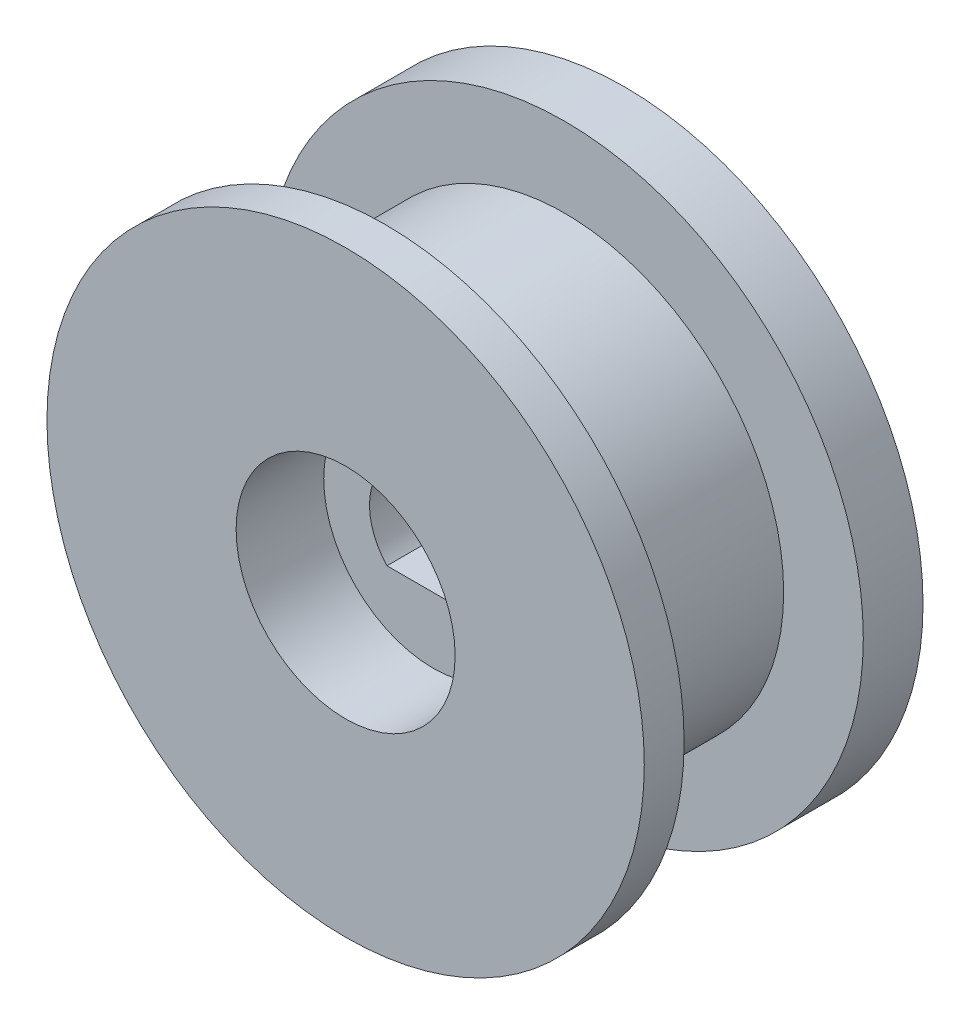
ISO-10303-21;
HEADER;
FILE_DESCRIPTION(('STEP AP214'),'2;1');
FILE_NAME('part.step','',(''),(''),'','','');
FILE_SCHEMA(('AUTOMOTIVE_DESIGN { 1 0 10303 214 1 1 1 1 }'));
ENDSEC;
DATA;
#1=APPLICATION_CONTEXT('core data for automotive mechanical design processes');
#2=APPLICATION_PROTOCOL_DEFINITION('international standard','automotive_design',2000,#1);
#3=PRODUCT_CONTEXT('',#1,'mechanical');
#4=PRODUCT('Part','Part','',(#3));
#5=PRODUCT_RELATED_PRODUCT_CATEGORY('part','',(#4));
#6=PRODUCT_DEFINITION_FORMATION('','',#4);
#7=PRODUCT_DEFINITION_CONTEXT('part definition',#1,'design');
#8=PRODUCT_DEFINITION('design','',#6,#7);
#9=PRODUCT_DEFINITION_SHAPE('','',#8);
#10=(LENGTH_UNIT() NAMED_UNIT(*) SI_UNIT(.MILLI.,.METRE.));
#11=(NAMED_UNIT(*) PLANE_ANGLE_UNIT() SI_UNIT($,.RADIAN.));
#12=(NAMED_UNIT(*) SI_UNIT($,.STERADIAN.) SOLID_ANGLE_UNIT());
#13=UNCERTAINTY_MEASURE_WITH_UNIT(LENGTH_MEASURE(1.E-05),#10,'distance_accuracy_value','');
#14=(GEOMETRIC_REPRESENTATION_CONTEXT(3) GLOBAL_UNCERTAINTY_ASSIGNED_CONTEXT((#13)) GLOBAL_UNIT_ASSIGNED_CONTEXT((#10,
#11,#12)) REPRESENTATION_CONTEXT('',''));
#15=CARTESIAN_POINT('',(0.,0.,0.));
#16=DIRECTION('',(0.,0.,1.));
#17=DIRECTION('',(1.,0.,0.));
#18=AXIS2_PLACEMENT_3D('',#15,#16,#17);
#19=CARTESIAN_POINT('',(0.,0.,3.));
#20=DIRECTION('',(0.,0.,-1.));
#21=DIRECTION('',(-1.,0.,0.));
#22=AXIS2_PLACEMENT_3D('',#19,#20,#21);
#23=CYLINDRICAL_SURFACE('',#22,1.6);
#24=CARTESIAN_POINT('',(0.,0.,-4.8));
#25=DIRECTION('',(0.,0.,-1.));
#26=DIRECTION('',(-1.,0.,0.));
#27=AXIS2_PLACEMENT_3D('',#24,#25,#26);
#28=CIRCLE('',#27,1.6);
#29=CARTESIAN_POINT('',(1.16189500386223,-1.1,-4.8));
#30=VERTEX_POINT('',#29);
#31=CARTESIAN_POINT('',(-1.16189500386223,-1.1,-4.8));
#32=VERTEX_POINT('',#31);
#33=EDGE_CURVE('E54',#30,#32,#28,.F.);
#34=ORIENTED_EDGE('',*,*,#33,.F.);
#35=DIRECTION('',(0.,0.,-1.));
#36=VECTOR('',#35,1.);
#37=CARTESIAN_POINT('',(1.16189500386223,-1.1,0.));
#38=LINE('',#37,#36);
#39=CARTESIAN_POINT('',(1.16189500386223,-1.1,-2.2));
#40=VERTEX_POINT('',#39);
#41=EDGE_CURVE('E72',#40,#30,#38,.T.);
#42=ORIENTED_EDGE('',*,*,#41,.F.);
#43=CARTESIAN_POINT('',(0.,0.,-2.2));
#44=DIRECTION('',(0.,0.,1.));
#45=DIRECTION('',(1.,0.,0.));
#46=AXIS2_PLACEMENT_3D('',#43,#44,#45);
#47=CIRCLE('',#46,1.6);
#48=CARTESIAN_POINT('',(-1.16189500386222,-1.1,-2.2));
#49=VERTEX_POINT('',#48);
#50=EDGE_CURVE('E60',#49,#40,#47,.F.);
#51=ORIENTED_EDGE('',*,*,#50,.F.);
#52=DIRECTION('',(0.,0.,-1.));
#53=VECTOR('',#52,1.);
#54=CARTESIAN_POINT('',(-1.16189500386223,-1.1,0.));
#55=LINE('',#54,#53);
#56=EDGE_CURVE('E73',#49,#32,#55,.T.);
#57=ORIENTED_EDGE('',*,*,#56,.T.);
#58=EDGE_LOOP('',(#34,#42,#51,#57));
#59=FACE_BOUND('',#58,.T.);
#60=ADVANCED_FACE('F39',(#59),#23,.F.);
#61=CARTESIAN_POINT('',(1.16189500386223,-1.1,0.));
#62=DIRECTION('',(0.,1.,0.));
#63=DIRECTION('',(0.,0.,1.));
#64=AXIS2_PLACEMENT_3D('',#61,#62,#63);
#65=PLANE('',#64);
#66=ORIENTED_EDGE('',*,*,#41,.T.);
#67=DIRECTION('',(-1.,0.,0.));
#68=VECTOR('',#67,1.);
#69=CARTESIAN_POINT('',(1.16189500386223,-1.1,-4.8));
#70=LINE('',#69,#68);
#71=EDGE_CURVE('E11',#30,#32,#70,.T.);
#72=ORIENTED_EDGE('',*,*,#71,.T.);
#73=ORIENTED_EDGE('',*,*,#56,.F.);
#74=DIRECTION('',(1.,0.,0.));
#75=VECTOR('',#74,1.);
#76=CARTESIAN_POINT('',(1.16189500386223,-1.1,-2.2));
#77=LINE('',#76,#75);
#78=EDGE_CURVE('E48',#49,#40,#77,.T.);
#79=ORIENTED_EDGE('',*,*,#78,.T.);
#80=EDGE_LOOP('',(#66,#72,#73,#79));
#81=FACE_BOUND('',#80,.T.);
#82=ADVANCED_FACE('F78',(#81),#65,.T.);
#83=CARTESIAN_POINT('',(0.,0.,0.));
#84=DIRECTION('',(0.,0.,1.));
#85=DIRECTION('',(1.,0.,0.));
#86=AXIS2_PLACEMENT_3D('',#83,#84,#85);
#87=CYLINDRICAL_SURFACE('',#86,7.5);
#88=CARTESIAN_POINT('',(0.,0.,-0.999999999999999));
#89=DIRECTION('',(0.,0.,1.));
#90=DIRECTION('',(1.,0.,0.));
#91=AXIS2_PLACEMENT_3D('',#88,#89,#90);
#92=CIRCLE('',#91,7.5);
#93=CARTESIAN_POINT('',(7.5,0.,-0.999999999999999));
#94=VERTEX_POINT('',#93);
#95=EDGE_CURVE('E106',#94,#94,#92,.T.);
#96=ORIENTED_EDGE('',*,*,#95,.T.);
#97=EDGE_LOOP('',(#96));
#98=FACE_BOUND('',#97,.T.);
#99=CARTESIAN_POINT('',(0.,0.,0.));
#100=DIRECTION('',(0.,0.,1.));
#101=DIRECTION('',(1.,0.,0.));
#102=AXIS2_PLACEMENT_3D('',#99,#100,#101);
#103=CIRCLE('',#102,7.5);
#104=CARTESIAN_POINT('',(7.5,0.,0.));
#105=VERTEX_POINT('',#104);
#106=EDGE_CURVE('E80',#105,#105,#103,.T.);
#107=ORIENTED_EDGE('',*,*,#106,.F.);
#108=EDGE_LOOP('',(#107));
#109=FACE_BOUND('',#108,.T.);
#110=ADVANCED_FACE('F41',(#98,#109),#87,.T.);
#111=CARTESIAN_POINT('',(7.5,0.,-0.999999999999999));
#112=DIRECTION('',(0.,0.,-1.));
#113=DIRECTION('',(-1.,0.,0.));
#114=AXIS2_PLACEMENT_3D('',#111,#112,#113);
#115=PLANE('',#114);
#116=CARTESIAN_POINT('',(0.,0.,-0.999999999999999));
#117=DIRECTION('',(0.,0.,1.));
#118=DIRECTION('',(1.,0.,0.));
#119=AXIS2_PLACEMENT_3D('',#116,#117,#118);
#120=CIRCLE('',#119,5.5);
#121=CARTESIAN_POINT('',(5.5,0.,-0.999999999999999));
#122=VERTEX_POINT('',#121);
#123=EDGE_CURVE('E102',#122,#122,#120,.T.);
#124=ORIENTED_EDGE('',*,*,#123,.T.);
#125=EDGE_LOOP('',(#124));
#126=FACE_BOUND('',#125,.T.);
#127=ORIENTED_EDGE('',*,*,#95,.F.);
#128=EDGE_LOOP('',(#127));
#129=FACE_BOUND('',#128,.T.);
#130=ADVANCED_FACE('F114',(#126,#129),#115,.T.);
#131=CARTESIAN_POINT('',(0.,0.,0.));
#132=DIRECTION('',(0.,0.,1.));
#133=DIRECTION('',(1.,0.,0.));
#134=AXIS2_PLACEMENT_3D('',#131,#132,#133);
#135=CYLINDRICAL_SURFACE('',#134,5.5);
#136=CARTESIAN_POINT('',(0.,0.,-5.5));
#137=DIRECTION('',(0.,0.,1.));
#138=DIRECTION('',(1.,0.,0.));
#139=AXIS2_PLACEMENT_3D('',#136,#137,#138);
#140=CIRCLE('',#139,5.5);
#141=CARTESIAN_POINT('',(5.5,0.,-5.5));
#142=VERTEX_POINT('',#141);
#143=EDGE_CURVE('E98',#142,#142,#140,.T.);
#144=ORIENTED_EDGE('',*,*,#143,.T.);
#145=EDGE_LOOP('',(#144));
#146=FACE_BOUND('',#145,.T.);
#147=ORIENTED_EDGE('',*,*,#123,.F.);
#148=EDGE_LOOP('',(#147));
#149=FACE_BOUND('',#148,.T.);
#150=ADVANCED_FACE('F116',(#146,#149),#135,.T.);
#151=CARTESIAN_POINT('',(7.5,0.,-5.5));
#152=DIRECTION('',(0.,0.,1.));
#153=DIRECTION('',(1.,0.,0.));
#154=AXIS2_PLACEMENT_3D('',#151,#152,#153);
#155=PLANE('',#154);
#156=CARTESIAN_POINT('',(0.,0.,-5.5));
#157=DIRECTION('',(0.,0.,1.));
#158=DIRECTION('',(1.,0.,0.));
#159=AXIS2_PLACEMENT_3D('',#156,#157,#158);
#160=CIRCLE('',#159,7.5);
#161=CARTESIAN_POINT('',(7.5,0.,-5.5));
#162=VERTEX_POINT('',#161);
#163=EDGE_CURVE('E94',#162,#162,#160,.T.);
#164=ORIENTED_EDGE('',*,*,#163,.T.);
#165=EDGE_LOOP('',(#164));
#166=FACE_BOUND('',#165,.T.);
#167=ORIENTED_EDGE('',*,*,#143,.F.);
#168=EDGE_LOOP('',(#167));
#169=FACE_BOUND('',#168,.T.);
#170=ADVANCED_FACE('F122',(#166,#169),#155,.T.);
#171=CARTESIAN_POINT('',(0.,0.,0.));
#172=DIRECTION('',(0.,0.,1.));
#173=DIRECTION('',(1.,0.,0.));
#174=AXIS2_PLACEMENT_3D('',#171,#172,#173);
#175=CYLINDRICAL_SURFACE('',#174,7.5);
#176=CARTESIAN_POINT('',(0.,0.,-7.));
#177=DIRECTION('',(0.,0.,1.));
#178=DIRECTION('',(1.,0.,0.));
#179=AXIS2_PLACEMENT_3D('',#176,#177,#178);
#180=CIRCLE('',#179,7.5);
#181=CARTESIAN_POINT('',(7.5,0.,-7.));
#182=VERTEX_POINT('',#181);
#183=EDGE_CURVE('E85',#182,#182,#180,.T.);
#184=ORIENTED_EDGE('',*,*,#183,.T.);
#185=EDGE_LOOP('',(#184));
#186=FACE_BOUND('',#185,.T.);
#187=ORIENTED_EDGE('',*,*,#163,.F.);
#188=EDGE_LOOP('',(#187));
#189=FACE_BOUND('',#188,.T.);
#190=ADVANCED_FACE('F142',(#186,#189),#175,.T.);
#191=CARTESIAN_POINT('',(3.,0.,-7.));
#192=DIRECTION('',(0.,0.,-1.));
#193=DIRECTION('',(-1.,0.,0.));
#194=AXIS2_PLACEMENT_3D('',#191,#192,#193);
#195=PLANE('',#194);
#196=CARTESIAN_POINT('',(0.,0.,-7.));
#197=DIRECTION('',(0.,0.,-1.));
#198=DIRECTION('',(-1.,0.,0.));
#199=AXIS2_PLACEMENT_3D('',#196,#197,#198);
#200=CIRCLE('',#199,2.75);
#201=CARTESIAN_POINT('',(-2.75,0.,-7.));
#202=VERTEX_POINT('',#201);
#203=EDGE_CURVE('E233',#202,#202,#200,.T.);
#204=ORIENTED_EDGE('',*,*,#203,.F.);
#205=EDGE_LOOP('',(#204));
#206=FACE_BOUND('',#205,.T.);
#207=ORIENTED_EDGE('',*,*,#183,.F.);
#208=EDGE_LOOP('',(#207));
#209=FACE_BOUND('',#208,.T.);
#210=ADVANCED_FACE('F138',(#206,#209),#195,.T.);
#211=CARTESIAN_POINT('',(1.25,0.,0.));
#212=DIRECTION('',(0.,0.,1.));
#213=DIRECTION('',(1.,0.,0.));
#214=AXIS2_PLACEMENT_3D('',#211,#212,#213);
#215=PLANE('',#214);
#216=CARTESIAN_POINT('',(0.,0.,0.));
#217=DIRECTION('',(0.,0.,1.));
#218=DIRECTION('',(1.,0.,0.));
#219=AXIS2_PLACEMENT_3D('',#216,#217,#218);
#220=CIRCLE('',#219,2.75);
#221=CARTESIAN_POINT('',(2.75,0.,0.));
#222=VERTEX_POINT('',#221);
#223=EDGE_CURVE('E75',#222,#222,#220,.T.);
#224=ORIENTED_EDGE('',*,*,#223,.F.);
#225=EDGE_LOOP('',(#224));
#226=FACE_BOUND('',#225,.T.);
#227=ORIENTED_EDGE('',*,*,#106,.T.);
#228=EDGE_LOOP('',(#227));
#229=FACE_BOUND('',#228,.T.);
#230=ADVANCED_FACE('F134',(#226,#229),#215,.T.);
#231=CARTESIAN_POINT('',(0.,0.,-2.2));
#232=DIRECTION('',(0.,0.,1.));
#233=DIRECTION('',(1.,0.,0.));
#234=AXIS2_PLACEMENT_3D('',#231,#232,#233);
#235=PLANE('',#234);
#236=CARTESIAN_POINT('',(0.,0.,-2.2));
#237=DIRECTION('',(0.,0.,1.));
#238=DIRECTION('',(1.,0.,0.));
#239=AXIS2_PLACEMENT_3D('',#236,#237,#238);
#240=CIRCLE('',#239,2.75);
#241=CARTESIAN_POINT('',(2.75,0.,-2.2));
#242=VERTEX_POINT('',#241);
#243=EDGE_CURVE('E239',#242,#242,#240,.T.);
#244=ORIENTED_EDGE('',*,*,#243,.T.);
#245=EDGE_LOOP('',(#244));
#246=FACE_BOUND('',#245,.T.);
#247=ORIENTED_EDGE('',*,*,#50,.T.);
#248=ORIENTED_EDGE('',*,*,#78,.F.);
#249=EDGE_LOOP('',(#247,#248));
#250=FACE_BOUND('',#249,.T.);
#251=ADVANCED_FACE('F137',(#246,#250),#235,.T.);
#252=CARTESIAN_POINT('',(0.,0.,-2.2));
#253=DIRECTION('',(0.,0.,1.));
#254=DIRECTION('',(1.,0.,0.));
#255=AXIS2_PLACEMENT_3D('',#252,#253,#254);
#256=CYLINDRICAL_SURFACE('',#255,2.75);
#257=ORIENTED_EDGE('',*,*,#243,.F.);
#258=EDGE_LOOP('',(#257));
#259=FACE_BOUND('',#258,.T.);
#260=ORIENTED_EDGE('',*,*,#223,.T.);
#261=EDGE_LOOP('',(#260));
#262=FACE_BOUND('',#261,.T.);
#263=ADVANCED_FACE('F180',(#259,#262),#256,.F.);
#264=CARTESIAN_POINT('',(0.,0.,-4.8));
#265=DIRECTION('',(0.,0.,-1.));
#266=DIRECTION('',(-1.,0.,0.));
#267=AXIS2_PLACEMENT_3D('',#264,#265,#266);
#268=PLANE('',#267);
#269=CARTESIAN_POINT('',(0.,0.,-4.8));
#270=DIRECTION('',(0.,0.,-1.));
#271=DIRECTION('',(-1.,0.,0.));
#272=AXIS2_PLACEMENT_3D('',#269,#270,#271);
#273=CIRCLE('',#272,2.75);
#274=CARTESIAN_POINT('',(-2.75,0.,-4.8));
#275=VERTEX_POINT('',#274);
#276=EDGE_CURVE('E76',#275,#275,#273,.T.);
#277=ORIENTED_EDGE('',*,*,#276,.T.);
#278=EDGE_LOOP('',(#277));
#279=FACE_BOUND('',#278,.T.);
#280=ORIENTED_EDGE('',*,*,#33,.T.);
#281=ORIENTED_EDGE('',*,*,#71,.F.);
#282=EDGE_LOOP('',(#280,#281));
#283=FACE_BOUND('',#282,.T.);
#284=ADVANCED_FACE('F65',(#279,#283),#268,.T.);
#285=CARTESIAN_POINT('',(0.,0.,-4.8));
#286=DIRECTION('',(0.,0.,-1.));
#287=DIRECTION('',(-1.,0.,0.));
#288=AXIS2_PLACEMENT_3D('',#285,#286,#287);
#289=CYLINDRICAL_SURFACE('',#288,2.75);
#290=ORIENTED_EDGE('',*,*,#276,.F.);
#291=EDGE_LOOP('',(#290));
#292=FACE_BOUND('',#291,.T.);
#293=ORIENTED_EDGE('',*,*,#203,.T.);
#294=EDGE_LOOP('',(#293));
#295=FACE_BOUND('',#294,.T.);
#296=ADVANCED_FACE('F214',(#292,#295),#289,.F.);
#297=CLOSED_SHELL('',(#60,#82,#110,#130,#150,#170,#190,#210,#230,#251,#263,#284,#296));
#298=MANIFOLD_SOLID_BREP('B2',#297);
#299=ADVANCED_BREP_SHAPE_REPRESENTATION('',(#18,#298),#14);
#300=SHAPE_DEFINITION_REPRESENTATION(#9,#299);
ENDSEC;
END-ISO-10303-21;
